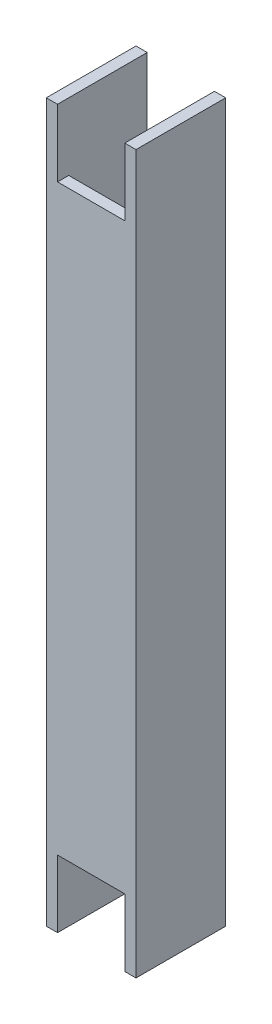
ISO-10303-21;
HEADER;
FILE_DESCRIPTION(('STEP AP214'),'2;1');
FILE_NAME('part.step','',(''),(''),'','','');
FILE_SCHEMA(('AUTOMOTIVE_DESIGN { 1 0 10303 214 1 1 1 1 }'));
ENDSEC;
DATA;
#1=APPLICATION_CONTEXT('core data for automotive mechanical design processes');
#2=APPLICATION_PROTOCOL_DEFINITION('international standard','automotive_design',2000,#1);
#3=PRODUCT_CONTEXT('',#1,'mechanical');
#4=PRODUCT('Part','Part','',(#3));
#5=PRODUCT_RELATED_PRODUCT_CATEGORY('part','',(#4));
#6=PRODUCT_DEFINITION_FORMATION('','',#4);
#7=PRODUCT_DEFINITION_CONTEXT('part definition',#1,'design');
#8=PRODUCT_DEFINITION('design','',#6,#7);
#9=PRODUCT_DEFINITION_SHAPE('','',#8);
#10=(LENGTH_UNIT() NAMED_UNIT(*) SI_UNIT(.MILLI.,.METRE.));
#11=(NAMED_UNIT(*) PLANE_ANGLE_UNIT() SI_UNIT($,.RADIAN.));
#12=(NAMED_UNIT(*) SI_UNIT($,.STERADIAN.) SOLID_ANGLE_UNIT());
#13=UNCERTAINTY_MEASURE_WITH_UNIT(LENGTH_MEASURE(1.E-05),#10,'distance_accuracy_value','');
#14=(GEOMETRIC_REPRESENTATION_CONTEXT(3) GLOBAL_UNCERTAINTY_ASSIGNED_CONTEXT((#13)) GLOBAL_UNIT_ASSIGNED_CONTEXT((#10,
#11,#12)) REPRESENTATION_CONTEXT('',''));
#15=CARTESIAN_POINT('',(0.,0.,0.));
#16=DIRECTION('',(0.,0.,1.));
#17=DIRECTION('',(1.,0.,0.));
#18=AXIS2_PLACEMENT_3D('',#15,#16,#17);
#19=CARTESIAN_POINT('',(0.,0.,0.));
#20=DIRECTION('',(0.,1.,0.));
#21=DIRECTION('',(0.,0.,1.));
#22=AXIS2_PLACEMENT_3D('',#19,#20,#21);
#23=PLANE('',#22);
#24=DIRECTION('',(-1.,0.,0.));
#25=VECTOR('',#24,1.);
#26=CARTESIAN_POINT('',(0.,0.,-25.4));
#27=LINE('',#26,#25);
#28=CARTESIAN_POINT('',(3.175,0.,-25.4));
#29=VERTEX_POINT('',#28);
#30=CARTESIAN_POINT('',(0.,0.,-25.4));
#31=VERTEX_POINT('',#30);
#32=EDGE_CURVE('E188',#29,#31,#27,.T.);
#33=ORIENTED_EDGE('',*,*,#32,.F.);
#34=DIRECTION('',(0.,0.,1.));
#35=VECTOR('',#34,1.);
#36=CARTESIAN_POINT('',(3.175,0.,0.));
#37=LINE('',#36,#35);
#38=CARTESIAN_POINT('',(3.175,0.,0.));
#39=VERTEX_POINT('',#38);
#40=EDGE_CURVE('E170',#29,#39,#37,.T.);
#41=ORIENTED_EDGE('',*,*,#40,.T.);
#42=DIRECTION('',(1.,0.,0.));
#43=VECTOR('',#42,1.);
#44=CARTESIAN_POINT('',(0.,0.,0.));
#45=LINE('',#44,#43);
#46=CARTESIAN_POINT('',(0.,0.,0.));
#47=VERTEX_POINT('',#46);
#48=EDGE_CURVE('E204',#47,#39,#45,.T.);
#49=ORIENTED_EDGE('',*,*,#48,.F.);
#50=DIRECTION('',(0.,0.,1.));
#51=VECTOR('',#50,1.);
#52=CARTESIAN_POINT('',(0.,0.,0.));
#53=LINE('',#52,#51);
#54=EDGE_CURVE('E198',#31,#47,#53,.T.);
#55=ORIENTED_EDGE('',*,*,#54,.F.);
#56=EDGE_LOOP('',(#33,#41,#49,#55));
#57=FACE_BOUND('',#56,.T.);
#58=ADVANCED_FACE('F57',(#57),#23,.F.);
#59=CARTESIAN_POINT('',(0.,203.2,0.));
#60=DIRECTION('',(0.,1.,0.));
#61=DIRECTION('',(0.,0.,1.));
#62=AXIS2_PLACEMENT_3D('',#59,#60,#61);
#63=PLANE('',#62);
#64=DIRECTION('',(0.,0.,1.));
#65=VECTOR('',#64,1.);
#66=CARTESIAN_POINT('',(3.175,203.2,0.));
#67=LINE('',#66,#65);
#68=CARTESIAN_POINT('',(3.175,203.2,-25.4));
#69=VERTEX_POINT('',#68);
#70=CARTESIAN_POINT('',(3.175,203.2,0.));
#71=VERTEX_POINT('',#70);
#72=EDGE_CURVE('E301',#69,#71,#67,.T.);
#73=ORIENTED_EDGE('',*,*,#72,.F.);
#74=DIRECTION('',(-1.,0.,0.));
#75=VECTOR('',#74,1.);
#76=CARTESIAN_POINT('',(0.,203.2,-25.4));
#77=LINE('',#76,#75);
#78=CARTESIAN_POINT('',(0.,203.2,-25.4));
#79=VERTEX_POINT('',#78);
#80=EDGE_CURVE('E259',#69,#79,#77,.T.);
#81=ORIENTED_EDGE('',*,*,#80,.T.);
#82=DIRECTION('',(0.,0.,1.));
#83=VECTOR('',#82,1.);
#84=CARTESIAN_POINT('',(0.,203.2,0.));
#85=LINE('',#84,#83);
#86=CARTESIAN_POINT('',(0.,203.2,0.));
#87=VERTEX_POINT('',#86);
#88=EDGE_CURVE('E203',#79,#87,#85,.T.);
#89=ORIENTED_EDGE('',*,*,#88,.T.);
#90=DIRECTION('',(1.,0.,0.));
#91=VECTOR('',#90,1.);
#92=CARTESIAN_POINT('',(0.,203.2,0.));
#93=LINE('',#92,#91);
#94=EDGE_CURVE('E254',#87,#71,#93,.T.);
#95=ORIENTED_EDGE('',*,*,#94,.T.);
#96=EDGE_LOOP('',(#73,#81,#89,#95));
#97=FACE_BOUND('',#96,.T.);
#98=ADVANCED_FACE('F309',(#97),#63,.T.);
#99=DIRECTION('',(0.,0.,-1.));
#100=VECTOR('',#99,1.);
#101=CARTESIAN_POINT('',(22.225,203.2,0.));
#102=LINE('',#101,#100);
#103=CARTESIAN_POINT('',(22.225,203.2,0.));
#104=VERTEX_POINT('',#103);
#105=CARTESIAN_POINT('',(22.225,203.2,-25.4));
#106=VERTEX_POINT('',#105);
#107=EDGE_CURVE('E246',#104,#106,#102,.T.);
#108=ORIENTED_EDGE('',*,*,#107,.F.);
#109=CARTESIAN_POINT('',(25.4,203.2,0.));
#110=VERTEX_POINT('',#109);
#111=EDGE_CURVE('E253',#104,#110,#93,.T.);
#112=ORIENTED_EDGE('',*,*,#111,.T.);
#113=DIRECTION('',(0.,0.,-1.));
#114=VECTOR('',#113,1.);
#115=CARTESIAN_POINT('',(25.4,203.2,0.));
#116=LINE('',#115,#114);
#117=CARTESIAN_POINT('',(25.4,203.2,-25.4));
#118=VERTEX_POINT('',#117);
#119=EDGE_CURVE('E257',#110,#118,#116,.T.);
#120=ORIENTED_EDGE('',*,*,#119,.T.);
#121=EDGE_CURVE('E211',#118,#106,#77,.T.);
#122=ORIENTED_EDGE('',*,*,#121,.T.);
#123=EDGE_LOOP('',(#108,#112,#120,#122));
#124=FACE_BOUND('',#123,.T.);
#125=ADVANCED_FACE('F282',(#124),#63,.T.);
#126=CARTESIAN_POINT('',(22.225,0.,0.));
#127=VERTEX_POINT('',#126);
#128=CARTESIAN_POINT('',(25.4,0.,0.));
#129=VERTEX_POINT('',#128);
#130=EDGE_CURVE('E262',#127,#129,#45,.T.);
#131=ORIENTED_EDGE('',*,*,#130,.F.);
#132=DIRECTION('',(0.,0.,-1.));
#133=VECTOR('',#132,1.);
#134=CARTESIAN_POINT('',(22.225,0.,0.));
#135=LINE('',#134,#133);
#136=CARTESIAN_POINT('',(22.225,0.,-25.4));
#137=VERTEX_POINT('',#136);
#138=EDGE_CURVE('E182',#127,#137,#135,.T.);
#139=ORIENTED_EDGE('',*,*,#138,.T.);
#140=CARTESIAN_POINT('',(25.4,0.,-25.4));
#141=VERTEX_POINT('',#140);
#142=EDGE_CURVE('E199',#141,#137,#27,.T.);
#143=ORIENTED_EDGE('',*,*,#142,.F.);
#144=DIRECTION('',(0.,0.,-1.));
#145=VECTOR('',#144,1.);
#146=CARTESIAN_POINT('',(25.4,0.,0.));
#147=LINE('',#146,#145);
#148=EDGE_CURVE('E200',#129,#141,#147,.T.);
#149=ORIENTED_EDGE('',*,*,#148,.F.);
#150=EDGE_LOOP('',(#131,#139,#143,#149));
#151=FACE_BOUND('',#150,.T.);
#152=ADVANCED_FACE('F278',(#151),#23,.F.);
#153=CARTESIAN_POINT('',(0.,203.2,0.));
#154=DIRECTION('',(1.,0.,0.));
#155=DIRECTION('',(0.,0.,-1.));
#156=AXIS2_PLACEMENT_3D('',#153,#154,#155);
#157=PLANE('',#156);
#158=ORIENTED_EDGE('',*,*,#54,.T.);
#159=DIRECTION('',(0.,-1.,0.));
#160=VECTOR('',#159,1.);
#161=CARTESIAN_POINT('',(0.,203.2,0.));
#162=LINE('',#161,#160);
#163=EDGE_CURVE('E217',#87,#47,#162,.T.);
#164=ORIENTED_EDGE('',*,*,#163,.F.);
#165=ORIENTED_EDGE('',*,*,#88,.F.);
#166=DIRECTION('',(0.,-1.,0.));
#167=VECTOR('',#166,1.);
#168=CARTESIAN_POINT('',(0.,203.2,-25.4));
#169=LINE('',#168,#167);
#170=EDGE_CURVE('E208',#79,#31,#169,.T.);
#171=ORIENTED_EDGE('',*,*,#170,.T.);
#172=EDGE_LOOP('',(#158,#164,#165,#171));
#173=FACE_BOUND('',#172,.T.);
#174=ADVANCED_FACE('F59',(#173),#157,.F.);
#175=CARTESIAN_POINT('',(0.,203.2,0.));
#176=DIRECTION('',(0.,0.,-1.));
#177=DIRECTION('',(-1.,0.,0.));
#178=AXIS2_PLACEMENT_3D('',#175,#176,#177);
#179=PLANE('',#178);
#180=ORIENTED_EDGE('',*,*,#48,.T.);
#181=DIRECTION('',(0.,-1.,0.));
#182=VECTOR('',#181,1.);
#183=CARTESIAN_POINT('',(3.175,0.,0.));
#184=LINE('',#183,#182);
#185=CARTESIAN_POINT('',(3.175,19.05,0.));
#186=VERTEX_POINT('',#185);
#187=EDGE_CURVE('E178',#186,#39,#184,.T.);
#188=ORIENTED_EDGE('',*,*,#187,.F.);
#189=DIRECTION('',(-1.,0.,0.));
#190=VECTOR('',#189,1.);
#191=CARTESIAN_POINT('',(3.175,19.05,0.));
#192=LINE('',#191,#190);
#193=CARTESIAN_POINT('',(22.225,19.05,0.));
#194=VERTEX_POINT('',#193);
#195=EDGE_CURVE('E194',#194,#186,#192,.T.);
#196=ORIENTED_EDGE('',*,*,#195,.F.);
#197=DIRECTION('',(0.,1.,0.));
#198=VECTOR('',#197,1.);
#199=CARTESIAN_POINT('',(22.225,0.,0.));
#200=LINE('',#199,#198);
#201=EDGE_CURVE('E271',#127,#194,#200,.T.);
#202=ORIENTED_EDGE('',*,*,#201,.F.);
#203=ORIENTED_EDGE('',*,*,#130,.T.);
#204=DIRECTION('',(0.,-1.,0.));
#205=VECTOR('',#204,1.);
#206=CARTESIAN_POINT('',(25.4,203.2,0.));
#207=LINE('',#206,#205);
#208=EDGE_CURVE('E214',#110,#129,#207,.T.);
#209=ORIENTED_EDGE('',*,*,#208,.F.);
#210=ORIENTED_EDGE('',*,*,#111,.F.);
#211=DIRECTION('',(0.,1.,0.));
#212=VECTOR('',#211,1.);
#213=CARTESIAN_POINT('',(22.225,203.2,0.));
#214=LINE('',#213,#212);
#215=CARTESIAN_POINT('',(22.225,184.15,0.));
#216=VERTEX_POINT('',#215);
#217=EDGE_CURVE('E286',#216,#104,#214,.T.);
#218=ORIENTED_EDGE('',*,*,#217,.F.);
#219=DIRECTION('',(1.,0.,0.));
#220=VECTOR('',#219,1.);
#221=CARTESIAN_POINT('',(3.175,184.15,0.));
#222=LINE('',#221,#220);
#223=CARTESIAN_POINT('',(3.175,184.15,0.));
#224=VERTEX_POINT('',#223);
#225=EDGE_CURVE('E288',#224,#216,#222,.T.);
#226=ORIENTED_EDGE('',*,*,#225,.F.);
#227=DIRECTION('',(0.,-1.,0.));
#228=VECTOR('',#227,1.);
#229=CARTESIAN_POINT('',(3.175,203.2,0.));
#230=LINE('',#229,#228);
#231=EDGE_CURVE('E294',#71,#224,#230,.T.);
#232=ORIENTED_EDGE('',*,*,#231,.F.);
#233=ORIENTED_EDGE('',*,*,#94,.F.);
#234=ORIENTED_EDGE('',*,*,#163,.T.);
#235=EDGE_LOOP('',(#180,#188,#196,#202,#203,#209,#210,#218,#226,#232,#233,#234));
#236=FACE_BOUND('',#235,.T.);
#237=ADVANCED_FACE('F267',(#236),#179,.F.);
#238=CARTESIAN_POINT('',(25.4,203.2,0.));
#239=DIRECTION('',(-1.,0.,0.));
#240=DIRECTION('',(0.,0.,1.));
#241=AXIS2_PLACEMENT_3D('',#238,#239,#240);
#242=PLANE('',#241);
#243=ORIENTED_EDGE('',*,*,#148,.T.);
#244=DIRECTION('',(0.,-1.,0.));
#245=VECTOR('',#244,1.);
#246=CARTESIAN_POINT('',(25.4,203.2,-25.4));
#247=LINE('',#246,#245);
#248=EDGE_CURVE('E210',#118,#141,#247,.T.);
#249=ORIENTED_EDGE('',*,*,#248,.F.);
#250=ORIENTED_EDGE('',*,*,#119,.F.);
#251=ORIENTED_EDGE('',*,*,#208,.T.);
#252=EDGE_LOOP('',(#243,#249,#250,#251));
#253=FACE_BOUND('',#252,.T.);
#254=ADVANCED_FACE('F275',(#253),#242,.F.);
#255=CARTESIAN_POINT('',(0.,203.2,-25.4));
#256=DIRECTION('',(0.,0.,1.));
#257=DIRECTION('',(1.,0.,0.));
#258=AXIS2_PLACEMENT_3D('',#255,#256,#257);
#259=PLANE('',#258);
#260=DIRECTION('',(-1.,0.,0.));
#261=VECTOR('',#260,1.);
#262=CARTESIAN_POINT('',(3.175,19.05,-25.4));
#263=LINE('',#262,#261);
#264=CARTESIAN_POINT('',(22.225,19.05,-25.4));
#265=VERTEX_POINT('',#264);
#266=CARTESIAN_POINT('',(3.175,19.05,-25.4));
#267=VERTEX_POINT('',#266);
#268=EDGE_CURVE('E192',#265,#267,#263,.T.);
#269=ORIENTED_EDGE('',*,*,#268,.T.);
#270=DIRECTION('',(0.,-1.,0.));
#271=VECTOR('',#270,1.);
#272=CARTESIAN_POINT('',(3.175,0.,-25.4));
#273=LINE('',#272,#271);
#274=EDGE_CURVE('E175',#267,#29,#273,.T.);
#275=ORIENTED_EDGE('',*,*,#274,.T.);
#276=ORIENTED_EDGE('',*,*,#32,.T.);
#277=ORIENTED_EDGE('',*,*,#170,.F.);
#278=ORIENTED_EDGE('',*,*,#80,.F.);
#279=DIRECTION('',(0.,-1.,0.));
#280=VECTOR('',#279,1.);
#281=CARTESIAN_POINT('',(3.175,203.2,-25.4));
#282=LINE('',#281,#280);
#283=CARTESIAN_POINT('',(3.175,184.15,-25.4));
#284=VERTEX_POINT('',#283);
#285=EDGE_CURVE('E289',#69,#284,#282,.T.);
#286=ORIENTED_EDGE('',*,*,#285,.T.);
#287=DIRECTION('',(1.,0.,0.));
#288=VECTOR('',#287,1.);
#289=CARTESIAN_POINT('',(3.175,184.15,-25.4));
#290=LINE('',#289,#288);
#291=CARTESIAN_POINT('',(22.225,184.15,-25.4));
#292=VERTEX_POINT('',#291);
#293=EDGE_CURVE('E292',#284,#292,#290,.T.);
#294=ORIENTED_EDGE('',*,*,#293,.T.);
#295=DIRECTION('',(0.,1.,0.));
#296=VECTOR('',#295,1.);
#297=CARTESIAN_POINT('',(22.225,203.2,-25.4));
#298=LINE('',#297,#296);
#299=EDGE_CURVE('E235',#292,#106,#298,.T.);
#300=ORIENTED_EDGE('',*,*,#299,.T.);
#301=ORIENTED_EDGE('',*,*,#121,.F.);
#302=ORIENTED_EDGE('',*,*,#248,.T.);
#303=ORIENTED_EDGE('',*,*,#142,.T.);
#304=DIRECTION('',(0.,1.,0.));
#305=VECTOR('',#304,1.);
#306=CARTESIAN_POINT('',(22.225,0.,-25.4));
#307=LINE('',#306,#305);
#308=EDGE_CURVE('E193',#137,#265,#307,.T.);
#309=ORIENTED_EDGE('',*,*,#308,.T.);
#310=EDGE_LOOP('',(#269,#275,#276,#277,#278,#286,#294,#300,#301,#302,#303,#309));
#311=FACE_BOUND('',#310,.T.);
#312=ADVANCED_FACE('F186',(#311),#259,.F.);
#313=CARTESIAN_POINT('',(3.175,203.2,0.));
#314=DIRECTION('',(1.,0.,0.));
#315=DIRECTION('',(0.,0.,-1.));
#316=AXIS2_PLACEMENT_3D('',#313,#314,#315);
#317=PLANE('',#316);
#318=DIRECTION('',(0.,-1.,0.));
#319=VECTOR('',#318,1.);
#320=CARTESIAN_POINT('',(3.175,203.2,-3.175));
#321=LINE('',#320,#319);
#322=CARTESIAN_POINT('',(3.175,184.15,-3.175));
#323=VERTEX_POINT('',#322);
#324=CARTESIAN_POINT('',(3.175,19.05,-3.175));
#325=VERTEX_POINT('',#324);
#326=EDGE_CURVE('E244',#323,#325,#321,.T.);
#327=ORIENTED_EDGE('',*,*,#326,.T.);
#328=DIRECTION('',(0.,0.,1.));
#329=VECTOR('',#328,1.);
#330=CARTESIAN_POINT('',(3.175,19.05,-25.4));
#331=LINE('',#330,#329);
#332=EDGE_CURVE('E320',#325,#186,#331,.T.);
#333=ORIENTED_EDGE('',*,*,#332,.T.);
#334=ORIENTED_EDGE('',*,*,#187,.T.);
#335=ORIENTED_EDGE('',*,*,#40,.F.);
#336=ORIENTED_EDGE('',*,*,#274,.F.);
#337=CARTESIAN_POINT('',(3.175,19.05,-22.225));
#338=VERTEX_POINT('',#337);
#339=EDGE_CURVE('E317',#267,#338,#331,.T.);
#340=ORIENTED_EDGE('',*,*,#339,.T.);
#341=DIRECTION('',(0.,-1.,0.));
#342=VECTOR('',#341,1.);
#343=CARTESIAN_POINT('',(3.175,203.2,-22.225));
#344=LINE('',#343,#342);
#345=CARTESIAN_POINT('',(3.175,184.15,-22.225));
#346=VERTEX_POINT('',#345);
#347=EDGE_CURVE('E241',#346,#338,#344,.T.);
#348=ORIENTED_EDGE('',*,*,#347,.F.);
#349=DIRECTION('',(0.,0.,1.));
#350=VECTOR('',#349,1.);
#351=CARTESIAN_POINT('',(3.175,184.15,-25.4));
#352=LINE('',#351,#350);
#353=EDGE_CURVE('E226',#284,#346,#352,.T.);
#354=ORIENTED_EDGE('',*,*,#353,.F.);
#355=ORIENTED_EDGE('',*,*,#285,.F.);
#356=ORIENTED_EDGE('',*,*,#72,.T.);
#357=ORIENTED_EDGE('',*,*,#231,.T.);
#358=EDGE_CURVE('E299',#323,#224,#352,.T.);
#359=ORIENTED_EDGE('',*,*,#358,.F.);
#360=EDGE_LOOP('',(#327,#333,#334,#335,#336,#340,#348,#354,#355,#356,#357,#359));
#361=FACE_BOUND('',#360,.T.);
#362=ADVANCED_FACE('F173',(#361),#317,.T.);
#363=CARTESIAN_POINT('',(0.,203.2,-3.175));
#364=DIRECTION('',(0.,0.,-1.));
#365=DIRECTION('',(-1.,0.,0.));
#366=AXIS2_PLACEMENT_3D('',#363,#364,#365);
#367=PLANE('',#366);
#368=DIRECTION('',(1.,0.,0.));
#369=VECTOR('',#368,1.);
#370=CARTESIAN_POINT('',(0.,19.05,-3.175));
#371=LINE('',#370,#369);
#372=CARTESIAN_POINT('',(22.225,19.05,-3.175));
#373=VERTEX_POINT('',#372);
#374=EDGE_CURVE('E308',#325,#373,#371,.T.);
#375=ORIENTED_EDGE('',*,*,#374,.F.);
#376=ORIENTED_EDGE('',*,*,#326,.F.);
#377=DIRECTION('',(-1.,0.,0.));
#378=VECTOR('',#377,1.);
#379=CARTESIAN_POINT('',(0.,184.15,-3.175));
#380=LINE('',#379,#378);
#381=CARTESIAN_POINT('',(22.225,184.15,-3.175));
#382=VERTEX_POINT('',#381);
#383=EDGE_CURVE('E183',#382,#323,#380,.T.);
#384=ORIENTED_EDGE('',*,*,#383,.F.);
#385=DIRECTION('',(0.,-1.,0.));
#386=VECTOR('',#385,1.);
#387=CARTESIAN_POINT('',(22.225,203.2,-3.175));
#388=LINE('',#387,#386);
#389=EDGE_CURVE('E240',#382,#373,#388,.T.);
#390=ORIENTED_EDGE('',*,*,#389,.T.);
#391=EDGE_LOOP('',(#375,#376,#384,#390));
#392=FACE_BOUND('',#391,.T.);
#393=ADVANCED_FACE('F357',(#392),#367,.T.);
#394=CARTESIAN_POINT('',(22.225,203.2,0.));
#395=DIRECTION('',(-1.,0.,0.));
#396=DIRECTION('',(0.,0.,1.));
#397=AXIS2_PLACEMENT_3D('',#394,#395,#396);
#398=PLANE('',#397);
#399=DIRECTION('',(0.,-1.,0.));
#400=VECTOR('',#399,1.);
#401=CARTESIAN_POINT('',(22.225,203.2,-22.225));
#402=LINE('',#401,#400);
#403=CARTESIAN_POINT('',(22.225,184.15,-22.225));
#404=VERTEX_POINT('',#403);
#405=CARTESIAN_POINT('',(22.225,19.05,-22.225));
#406=VERTEX_POINT('',#405);
#407=EDGE_CURVE('E233',#404,#406,#402,.T.);
#408=ORIENTED_EDGE('',*,*,#407,.T.);
#409=DIRECTION('',(0.,0.,1.));
#410=VECTOR('',#409,1.);
#411=CARTESIAN_POINT('',(22.225,19.05,-25.4));
#412=LINE('',#411,#410);
#413=EDGE_CURVE('E318',#265,#406,#412,.T.);
#414=ORIENTED_EDGE('',*,*,#413,.F.);
#415=ORIENTED_EDGE('',*,*,#308,.F.);
#416=ORIENTED_EDGE('',*,*,#138,.F.);
#417=ORIENTED_EDGE('',*,*,#201,.T.);
#418=EDGE_CURVE('E72',#373,#194,#412,.T.);
#419=ORIENTED_EDGE('',*,*,#418,.F.);
#420=ORIENTED_EDGE('',*,*,#389,.F.);
#421=DIRECTION('',(0.,0.,1.));
#422=VECTOR('',#421,1.);
#423=CARTESIAN_POINT('',(22.225,184.15,-25.4));
#424=LINE('',#423,#422);
#425=EDGE_CURVE('E80',#382,#216,#424,.T.);
#426=ORIENTED_EDGE('',*,*,#425,.T.);
#427=ORIENTED_EDGE('',*,*,#217,.T.);
#428=ORIENTED_EDGE('',*,*,#107,.T.);
#429=ORIENTED_EDGE('',*,*,#299,.F.);
#430=EDGE_CURVE('E224',#292,#404,#424,.T.);
#431=ORIENTED_EDGE('',*,*,#430,.T.);
#432=EDGE_LOOP('',(#408,#414,#415,#416,#417,#419,#420,#426,#427,#428,#429,#431));
#433=FACE_BOUND('',#432,.T.);
#434=ADVANCED_FACE('F232',(#433),#398,.T.);
#435=CARTESIAN_POINT('',(0.,203.2,-22.225));
#436=DIRECTION('',(0.,0.,1.));
#437=DIRECTION('',(1.,0.,0.));
#438=AXIS2_PLACEMENT_3D('',#435,#436,#437);
#439=PLANE('',#438);
#440=DIRECTION('',(-1.,0.,0.));
#441=VECTOR('',#440,1.);
#442=CARTESIAN_POINT('',(0.,19.05,-22.225));
#443=LINE('',#442,#441);
#444=EDGE_CURVE('E12',#406,#338,#443,.T.);
#445=ORIENTED_EDGE('',*,*,#444,.F.);
#446=ORIENTED_EDGE('',*,*,#407,.F.);
#447=DIRECTION('',(1.,0.,0.));
#448=VECTOR('',#447,1.);
#449=CARTESIAN_POINT('',(0.,184.15,-22.225));
#450=LINE('',#449,#448);
#451=EDGE_CURVE('E65',#346,#404,#450,.T.);
#452=ORIENTED_EDGE('',*,*,#451,.F.);
#453=ORIENTED_EDGE('',*,*,#347,.T.);
#454=EDGE_LOOP('',(#445,#446,#452,#453));
#455=FACE_BOUND('',#454,.T.);
#456=ADVANCED_FACE('F239',(#455),#439,.T.);
#457=CARTESIAN_POINT('',(3.175,184.15,-25.4));
#458=DIRECTION('',(0.,-1.,0.));
#459=DIRECTION('',(0.,0.,-1.));
#460=AXIS2_PLACEMENT_3D('',#457,#458,#459);
#461=PLANE('',#460);
#462=ORIENTED_EDGE('',*,*,#451,.T.);
#463=ORIENTED_EDGE('',*,*,#430,.F.);
#464=ORIENTED_EDGE('',*,*,#293,.F.);
#465=ORIENTED_EDGE('',*,*,#353,.T.);
#466=EDGE_LOOP('',(#462,#463,#464,#465));
#467=FACE_BOUND('',#466,.T.);
#468=ADVANCED_FACE('F222',(#467),#461,.F.);
#469=ORIENTED_EDGE('',*,*,#383,.T.);
#470=ORIENTED_EDGE('',*,*,#358,.T.);
#471=ORIENTED_EDGE('',*,*,#225,.T.);
#472=ORIENTED_EDGE('',*,*,#425,.F.);
#473=EDGE_LOOP('',(#469,#470,#471,#472));
#474=FACE_BOUND('',#473,.T.);
#475=ADVANCED_FACE('F333',(#474),#461,.F.);
#476=CARTESIAN_POINT('',(3.175,19.05,-25.4));
#477=DIRECTION('',(0.,1.,0.));
#478=DIRECTION('',(0.,0.,1.));
#479=AXIS2_PLACEMENT_3D('',#476,#477,#478);
#480=PLANE('',#479);
#481=ORIENTED_EDGE('',*,*,#444,.T.);
#482=ORIENTED_EDGE('',*,*,#339,.F.);
#483=ORIENTED_EDGE('',*,*,#268,.F.);
#484=ORIENTED_EDGE('',*,*,#413,.T.);
#485=EDGE_LOOP('',(#481,#482,#483,#484));
#486=FACE_BOUND('',#485,.T.);
#487=ADVANCED_FACE('F331',(#486),#480,.F.);
#488=ORIENTED_EDGE('',*,*,#374,.T.);
#489=ORIENTED_EDGE('',*,*,#418,.T.);
#490=ORIENTED_EDGE('',*,*,#195,.T.);
#491=ORIENTED_EDGE('',*,*,#332,.F.);
#492=EDGE_LOOP('',(#488,#489,#490,#491));
#493=FACE_BOUND('',#492,.T.);
#494=ADVANCED_FACE('F328',(#493),#480,.F.);
#495=CLOSED_SHELL('',(#58,#98,#125,#152,#174,#237,#254,#312,#362,#393,#434,#456,#468,#475,#487,#494));
#496=MANIFOLD_SOLID_BREP('B2',#495);
#497=ADVANCED_BREP_SHAPE_REPRESENTATION('',(#18,#496),#14);
#498=SHAPE_DEFINITION_REPRESENTATION(#9,#497);
ENDSEC;
END-ISO-10303-21;
